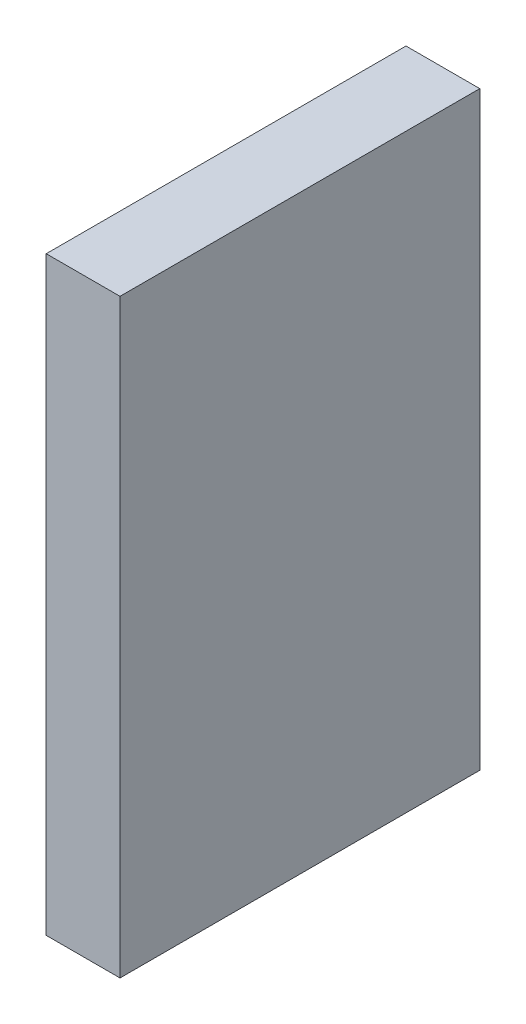
ISO-10303-21;
HEADER;
FILE_DESCRIPTION(('STEP AP214'),'2;1');
FILE_NAME('part.step','',(''),(''),'','','');
FILE_SCHEMA(('AUTOMOTIVE_DESIGN { 1 0 10303 214 1 1 1 1 }'));
ENDSEC;
DATA;
#1=APPLICATION_CONTEXT('core data for automotive mechanical design processes');
#2=APPLICATION_PROTOCOL_DEFINITION('international standard','automotive_design',2000,#1);
#3=PRODUCT_CONTEXT('',#1,'mechanical');
#4=PRODUCT('Part','Part','',(#3));
#5=PRODUCT_RELATED_PRODUCT_CATEGORY('part','',(#4));
#6=PRODUCT_DEFINITION_FORMATION('','',#4);
#7=PRODUCT_DEFINITION_CONTEXT('part definition',#1,'design');
#8=PRODUCT_DEFINITION('design','',#6,#7);
#9=PRODUCT_DEFINITION_SHAPE('','',#8);
#10=(LENGTH_UNIT() NAMED_UNIT(*) SI_UNIT(.MILLI.,.METRE.));
#11=(NAMED_UNIT(*) PLANE_ANGLE_UNIT() SI_UNIT($,.RADIAN.));
#12=(NAMED_UNIT(*) SI_UNIT($,.STERADIAN.) SOLID_ANGLE_UNIT());
#13=UNCERTAINTY_MEASURE_WITH_UNIT(LENGTH_MEASURE(1.E-05),#10,'distance_accuracy_value','');
#14=(GEOMETRIC_REPRESENTATION_CONTEXT(3) GLOBAL_UNCERTAINTY_ASSIGNED_CONTEXT((#13)) GLOBAL_UNIT_ASSIGNED_CONTEXT((#10,
#11,#12)) REPRESENTATION_CONTEXT('',''));
#15=CARTESIAN_POINT('',(0.,0.,0.));
#16=DIRECTION('',(0.,0.,1.));
#17=DIRECTION('',(1.,0.,0.));
#18=AXIS2_PLACEMENT_3D('',#15,#16,#17);
#19=CARTESIAN_POINT('',(-2.,16.,19.5));
#20=DIRECTION('',(1.,0.,0.));
#21=DIRECTION('',(0.,1.,0.));
#22=AXIS2_PLACEMENT_3D('',#19,#20,#21);
#23=PLANE('',#22);
#24=DIRECTION('',(0.,-1.,0.));
#25=VECTOR('',#24,1.);
#26=CARTESIAN_POINT('',(-2.,16.,0.));
#27=LINE('',#26,#25);
#28=CARTESIAN_POINT('',(-2.,16.,0.));
#29=VERTEX_POINT('',#28);
#30=CARTESIAN_POINT('',(-2.00000000000001,-16.,0.));
#31=VERTEX_POINT('',#30);
#32=EDGE_CURVE('E113',#29,#31,#27,.T.);
#33=ORIENTED_EDGE('',*,*,#32,.T.);
#34=DIRECTION('',(0.,0.,-1.));
#35=VECTOR('',#34,1.);
#36=CARTESIAN_POINT('',(-2.00000000000001,-16.,19.5));
#37=LINE('',#36,#35);
#38=CARTESIAN_POINT('',(-2.00000000000001,-16.,19.5));
#39=VERTEX_POINT('',#38);
#40=EDGE_CURVE('E11',#39,#31,#37,.T.);
#41=ORIENTED_EDGE('',*,*,#40,.F.);
#42=DIRECTION('',(0.,-1.,0.));
#43=VECTOR('',#42,1.);
#44=CARTESIAN_POINT('',(-2.,16.,19.5));
#45=LINE('',#44,#43);
#46=CARTESIAN_POINT('',(-2.,16.,19.5));
#47=VERTEX_POINT('',#46);
#48=EDGE_CURVE('E97',#47,#39,#45,.T.);
#49=ORIENTED_EDGE('',*,*,#48,.F.);
#50=DIRECTION('',(0.,0.,-1.));
#51=VECTOR('',#50,1.);
#52=CARTESIAN_POINT('',(-2.,16.,19.5));
#53=LINE('',#52,#51);
#54=EDGE_CURVE('E109',#47,#29,#53,.T.);
#55=ORIENTED_EDGE('',*,*,#54,.T.);
#56=EDGE_LOOP('',(#33,#41,#49,#55));
#57=FACE_BOUND('',#56,.T.);
#58=ADVANCED_FACE('F45',(#57),#23,.F.);
#59=CARTESIAN_POINT('',(-2.00000000000001,-16.,19.5));
#60=DIRECTION('',(0.,1.,0.));
#61=DIRECTION('',(0.,0.,1.));
#62=AXIS2_PLACEMENT_3D('',#59,#60,#61);
#63=PLANE('',#62);
#64=DIRECTION('',(1.,0.,0.));
#65=VECTOR('',#64,1.);
#66=CARTESIAN_POINT('',(-2.00000000000001,-16.,0.));
#67=LINE('',#66,#65);
#68=CARTESIAN_POINT('',(2.00000000000001,-16.,0.));
#69=VERTEX_POINT('',#68);
#70=EDGE_CURVE('E102',#31,#69,#67,.T.);
#71=ORIENTED_EDGE('',*,*,#70,.T.);
#72=DIRECTION('',(0.,0.,-1.));
#73=VECTOR('',#72,1.);
#74=CARTESIAN_POINT('',(2.00000000000001,-16.,19.5));
#75=LINE('',#74,#73);
#76=CARTESIAN_POINT('',(2.00000000000001,-16.,19.5));
#77=VERTEX_POINT('',#76);
#78=EDGE_CURVE('E54',#77,#69,#75,.T.);
#79=ORIENTED_EDGE('',*,*,#78,.F.);
#80=DIRECTION('',(1.,0.,0.));
#81=VECTOR('',#80,1.);
#82=CARTESIAN_POINT('',(-2.00000000000001,-16.,19.5));
#83=LINE('',#82,#81);
#84=EDGE_CURVE('E92',#39,#77,#83,.T.);
#85=ORIENTED_EDGE('',*,*,#84,.F.);
#86=ORIENTED_EDGE('',*,*,#40,.T.);
#87=EDGE_LOOP('',(#71,#79,#85,#86));
#88=FACE_BOUND('',#87,.T.);
#89=ADVANCED_FACE('F101',(#88),#63,.F.);
#90=CARTESIAN_POINT('',(2.,16.,19.5));
#91=DIRECTION('',(-1.,0.,0.));
#92=DIRECTION('',(0.,-1.,0.));
#93=AXIS2_PLACEMENT_3D('',#90,#91,#92);
#94=PLANE('',#93);
#95=DIRECTION('',(0.,1.,0.));
#96=VECTOR('',#95,1.);
#97=CARTESIAN_POINT('',(2.,16.,0.));
#98=LINE('',#97,#96);
#99=CARTESIAN_POINT('',(2.,16.,0.));
#100=VERTEX_POINT('',#99);
#101=EDGE_CURVE('E79',#69,#100,#98,.T.);
#102=ORIENTED_EDGE('',*,*,#101,.T.);
#103=DIRECTION('',(0.,0.,-1.));
#104=VECTOR('',#103,1.);
#105=CARTESIAN_POINT('',(2.,16.,19.5));
#106=LINE('',#105,#104);
#107=CARTESIAN_POINT('',(2.,16.,19.5));
#108=VERTEX_POINT('',#107);
#109=EDGE_CURVE('E104',#108,#100,#106,.T.);
#110=ORIENTED_EDGE('',*,*,#109,.F.);
#111=DIRECTION('',(0.,1.,0.));
#112=VECTOR('',#111,1.);
#113=CARTESIAN_POINT('',(2.,16.,19.5));
#114=LINE('',#113,#112);
#115=EDGE_CURVE('E95',#77,#108,#114,.T.);
#116=ORIENTED_EDGE('',*,*,#115,.F.);
#117=ORIENTED_EDGE('',*,*,#78,.T.);
#118=EDGE_LOOP('',(#102,#110,#116,#117));
#119=FACE_BOUND('',#118,.T.);
#120=ADVANCED_FACE('F105',(#119),#94,.F.);
#121=CARTESIAN_POINT('',(-2.,16.,19.5));
#122=DIRECTION('',(0.,-1.,0.));
#123=DIRECTION('',(0.,0.,-1.));
#124=AXIS2_PLACEMENT_3D('',#121,#122,#123);
#125=PLANE('',#124);
#126=DIRECTION('',(-1.,0.,0.));
#127=VECTOR('',#126,1.);
#128=CARTESIAN_POINT('',(-2.,16.,0.));
#129=LINE('',#128,#127);
#130=EDGE_CURVE('E85',#100,#29,#129,.T.);
#131=ORIENTED_EDGE('',*,*,#130,.T.);
#132=ORIENTED_EDGE('',*,*,#54,.F.);
#133=DIRECTION('',(-1.,0.,0.));
#134=VECTOR('',#133,1.);
#135=CARTESIAN_POINT('',(-2.,16.,19.5));
#136=LINE('',#135,#134);
#137=EDGE_CURVE('E62',#108,#47,#136,.T.);
#138=ORIENTED_EDGE('',*,*,#137,.F.);
#139=ORIENTED_EDGE('',*,*,#109,.T.);
#140=EDGE_LOOP('',(#131,#132,#138,#139));
#141=FACE_BOUND('',#140,.T.);
#142=ADVANCED_FACE('F126',(#141),#125,.F.);
#143=CARTESIAN_POINT('',(0.,0.,19.5));
#144=DIRECTION('',(0.,0.,1.));
#145=DIRECTION('',(1.,0.,0.));
#146=AXIS2_PLACEMENT_3D('',#143,#144,#145);
#147=PLANE('',#146);
#148=ORIENTED_EDGE('',*,*,#48,.T.);
#149=ORIENTED_EDGE('',*,*,#84,.T.);
#150=ORIENTED_EDGE('',*,*,#115,.T.);
#151=ORIENTED_EDGE('',*,*,#137,.T.);
#152=EDGE_LOOP('',(#148,#149,#150,#151));
#153=FACE_BOUND('',#152,.T.);
#154=ADVANCED_FACE('F93',(#153),#147,.T.);
#155=CARTESIAN_POINT('',(0.,0.,0.));
#156=DIRECTION('',(0.,0.,1.));
#157=DIRECTION('',(1.,0.,0.));
#158=AXIS2_PLACEMENT_3D('',#155,#156,#157);
#159=PLANE('',#158);
#160=ORIENTED_EDGE('',*,*,#32,.F.);
#161=ORIENTED_EDGE('',*,*,#130,.F.);
#162=ORIENTED_EDGE('',*,*,#101,.F.);
#163=ORIENTED_EDGE('',*,*,#70,.F.);
#164=EDGE_LOOP('',(#160,#161,#162,#163));
#165=FACE_BOUND('',#164,.T.);
#166=ADVANCED_FACE('F129',(#165),#159,.F.);
#167=CLOSED_SHELL('',(#58,#89,#120,#142,#154,#166));
#168=MANIFOLD_SOLID_BREP('B2',#167);
#169=ADVANCED_BREP_SHAPE_REPRESENTATION('',(#18,#168),#14);
#170=SHAPE_DEFINITION_REPRESENTATION(#9,#169);
ENDSEC;
END-ISO-10303-21;
